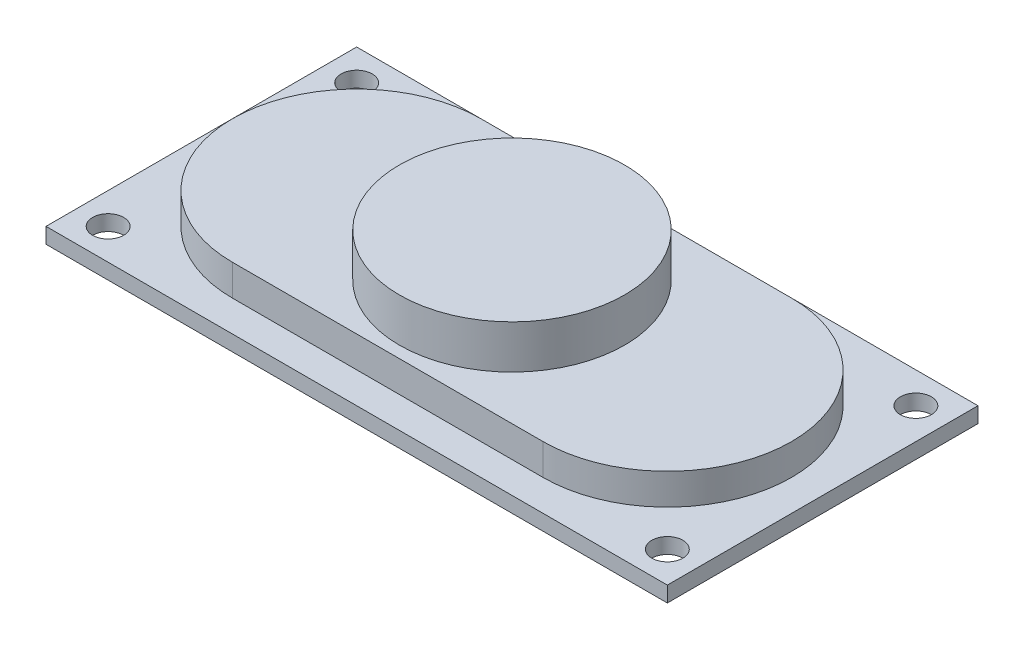
ISO-10303-21;
HEADER;
FILE_DESCRIPTION(('STEP AP214'),'2;1');
FILE_NAME('part.step','',(''),(''),'','','');
FILE_SCHEMA(('AUTOMOTIVE_DESIGN { 1 0 10303 214 1 1 1 1 }'));
ENDSEC;
DATA;
#1=APPLICATION_CONTEXT('core data for automotive mechanical design processes');
#2=APPLICATION_PROTOCOL_DEFINITION('international standard','automotive_design',2000,#1);
#3=PRODUCT_CONTEXT('',#1,'mechanical');
#4=PRODUCT('Part','Part','',(#3));
#5=PRODUCT_RELATED_PRODUCT_CATEGORY('part','',(#4));
#6=PRODUCT_DEFINITION_FORMATION('','',#4);
#7=PRODUCT_DEFINITION_CONTEXT('part definition',#1,'design');
#8=PRODUCT_DEFINITION('design','',#6,#7);
#9=PRODUCT_DEFINITION_SHAPE('','',#8);
#10=(LENGTH_UNIT() NAMED_UNIT(*) SI_UNIT(.MILLI.,.METRE.));
#11=(NAMED_UNIT(*) PLANE_ANGLE_UNIT() SI_UNIT($,.RADIAN.));
#12=(NAMED_UNIT(*) SI_UNIT($,.STERADIAN.) SOLID_ANGLE_UNIT());
#13=UNCERTAINTY_MEASURE_WITH_UNIT(LENGTH_MEASURE(1.E-05),#10,'distance_accuracy_value','');
#14=(GEOMETRIC_REPRESENTATION_CONTEXT(3) GLOBAL_UNCERTAINTY_ASSIGNED_CONTEXT((#13)) GLOBAL_UNIT_ASSIGNED_CONTEXT((#10,
#11,#12)) REPRESENTATION_CONTEXT('',''));
#15=CARTESIAN_POINT('',(0.,0.,0.));
#16=DIRECTION('',(0.,0.,1.));
#17=DIRECTION('',(1.,0.,0.));
#18=AXIS2_PLACEMENT_3D('',#15,#16,#17);
#19=CARTESIAN_POINT('',(0.,1.,0.));
#20=DIRECTION('',(0.,1.,0.));
#21=DIRECTION('',(0.,0.,1.));
#22=AXIS2_PLACEMENT_3D('',#19,#20,#21);
#23=PLANE('',#22);
#24=CARTESIAN_POINT('',(18.,1.,-8.));
#25=DIRECTION('',(0.,1.,0.));
#26=DIRECTION('',(0.,0.,-1.));
#27=AXIS2_PLACEMENT_3D('',#24,#25,#26);
#28=CIRCLE('',#27,1.);
#29=CARTESIAN_POINT('',(18.,1.,-9.));
#30=VERTEX_POINT('',#29);
#31=EDGE_CURVE('E202',#30,#30,#28,.T.);
#32=ORIENTED_EDGE('',*,*,#31,.F.);
#33=EDGE_LOOP('',(#32));
#34=FACE_BOUND('',#33,.T.);
#35=CARTESIAN_POINT('',(18.,1.,8.));
#36=DIRECTION('',(0.,1.,0.));
#37=DIRECTION('',(0.,0.,1.));
#38=AXIS2_PLACEMENT_3D('',#35,#36,#37);
#39=CIRCLE('',#38,1.);
#40=CARTESIAN_POINT('',(18.,1.,9.));
#41=VERTEX_POINT('',#40);
#42=EDGE_CURVE('E208',#41,#41,#39,.T.);
#43=ORIENTED_EDGE('',*,*,#42,.F.);
#44=EDGE_LOOP('',(#43));
#45=FACE_BOUND('',#44,.T.);
#46=CARTESIAN_POINT('',(-18.,1.,8.));
#47=DIRECTION('',(0.,1.,0.));
#48=DIRECTION('',(0.,0.,-1.));
#49=AXIS2_PLACEMENT_3D('',#46,#47,#48);
#50=CIRCLE('',#49,1.);
#51=CARTESIAN_POINT('',(-18.,1.,7.));
#52=VERTEX_POINT('',#51);
#53=EDGE_CURVE('E197',#52,#52,#50,.T.);
#54=ORIENTED_EDGE('',*,*,#53,.F.);
#55=EDGE_LOOP('',(#54));
#56=FACE_BOUND('',#55,.T.);
#57=CARTESIAN_POINT('',(-18.,1.,-8.));
#58=DIRECTION('',(0.,1.,0.));
#59=DIRECTION('',(0.,0.,1.));
#60=AXIS2_PLACEMENT_3D('',#57,#58,#59);
#61=CIRCLE('',#60,1.);
#62=CARTESIAN_POINT('',(-18.,1.,-7.));
#63=VERTEX_POINT('',#62);
#64=EDGE_CURVE('E201',#63,#63,#61,.T.);
#65=ORIENTED_EDGE('',*,*,#64,.F.);
#66=EDGE_LOOP('',(#65));
#67=FACE_BOUND('',#66,.T.);
#68=DIRECTION('',(0.,0.,1.));
#69=VECTOR('',#68,1.);
#70=CARTESIAN_POINT('',(-20.,1.,-10.));
#71=LINE('',#70,#69);
#72=CARTESIAN_POINT('',(-20.,1.,-10.));
#73=VERTEX_POINT('',#72);
#74=CARTESIAN_POINT('',(-20.,1.,10.));
#75=VERTEX_POINT('',#74);
#76=EDGE_CURVE('E222',#73,#75,#71,.T.);
#77=ORIENTED_EDGE('',*,*,#76,.T.);
#78=DIRECTION('',(1.,0.,0.));
#79=VECTOR('',#78,1.);
#80=CARTESIAN_POINT('',(-20.,1.,10.));
#81=LINE('',#80,#79);
#82=CARTESIAN_POINT('',(20.,1.,9.99999999999999));
#83=VERTEX_POINT('',#82);
#84=EDGE_CURVE('E225',#75,#83,#81,.T.);
#85=ORIENTED_EDGE('',*,*,#84,.T.);
#86=DIRECTION('',(0.,0.,-1.));
#87=VECTOR('',#86,1.);
#88=CARTESIAN_POINT('',(20.,1.,-10.));
#89=LINE('',#88,#87);
#90=CARTESIAN_POINT('',(20.,1.,-10.));
#91=VERTEX_POINT('',#90);
#92=EDGE_CURVE('E228',#83,#91,#89,.T.);
#93=ORIENTED_EDGE('',*,*,#92,.T.);
#94=DIRECTION('',(-1.,0.,0.));
#95=VECTOR('',#94,1.);
#96=CARTESIAN_POINT('',(-20.,1.,-10.));
#97=LINE('',#96,#95);
#98=EDGE_CURVE('E230',#91,#73,#97,.T.);
#99=ORIENTED_EDGE('',*,*,#98,.T.);
#100=EDGE_LOOP('',(#77,#85,#93,#99));
#101=FACE_BOUND('',#100,.T.);
#102=DIRECTION('',(1.,0.,0.));
#103=VECTOR('',#102,1.);
#104=CARTESIAN_POINT('',(-10.,1.,8.));
#105=LINE('',#104,#103);
#106=CARTESIAN_POINT('',(-10.,1.,8.));
#107=VERTEX_POINT('',#106);
#108=CARTESIAN_POINT('',(10.,1.,8.));
#109=VERTEX_POINT('',#108);
#110=EDGE_CURVE('E184',#107,#109,#105,.T.);
#111=ORIENTED_EDGE('',*,*,#110,.F.);
#112=CARTESIAN_POINT('',(-10.,1.,0.));
#113=DIRECTION('',(0.,1.,0.));
#114=DIRECTION('',(0.,0.,1.));
#115=AXIS2_PLACEMENT_3D('',#112,#113,#114);
#116=CIRCLE('',#115,8.);
#117=CARTESIAN_POINT('',(-10.,1.,-8.));
#118=VERTEX_POINT('',#117);
#119=EDGE_CURVE('E161',#118,#107,#116,.T.);
#120=ORIENTED_EDGE('',*,*,#119,.F.);
#121=DIRECTION('',(-1.,0.,0.));
#122=VECTOR('',#121,1.);
#123=CARTESIAN_POINT('',(-10.,1.,-8.));
#124=LINE('',#123,#122);
#125=CARTESIAN_POINT('',(10.,1.,-8.));
#126=VERTEX_POINT('',#125);
#127=EDGE_CURVE('E175',#126,#118,#124,.T.);
#128=ORIENTED_EDGE('',*,*,#127,.F.);
#129=CARTESIAN_POINT('',(10.,1.,0.));
#130=DIRECTION('',(0.,1.,0.));
#131=DIRECTION('',(0.,0.,1.));
#132=AXIS2_PLACEMENT_3D('',#129,#130,#131);
#133=CIRCLE('',#132,8.);
#134=EDGE_CURVE('E186',#109,#126,#133,.T.);
#135=ORIENTED_EDGE('',*,*,#134,.F.);
#136=EDGE_LOOP('',(#111,#120,#128,#135));
#137=FACE_BOUND('',#136,.T.);
#138=ADVANCED_FACE('F37',(#34,#45,#56,#67,#101,#137),#23,.T.);
#139=CARTESIAN_POINT('',(-20.,1.,-10.));
#140=DIRECTION('',(1.,0.,0.));
#141=DIRECTION('',(0.,0.,-1.));
#142=AXIS2_PLACEMENT_3D('',#139,#140,#141);
#143=PLANE('',#142);
#144=DIRECTION('',(0.,0.,1.));
#145=VECTOR('',#144,1.);
#146=CARTESIAN_POINT('',(-20.,0.,-10.));
#147=LINE('',#146,#145);
#148=CARTESIAN_POINT('',(-20.,0.,-10.));
#149=VERTEX_POINT('',#148);
#150=CARTESIAN_POINT('',(-20.,0.,10.));
#151=VERTEX_POINT('',#150);
#152=EDGE_CURVE('E219',#149,#151,#147,.T.);
#153=ORIENTED_EDGE('',*,*,#152,.T.);
#154=DIRECTION('',(0.,-1.,0.));
#155=VECTOR('',#154,1.);
#156=CARTESIAN_POINT('',(-20.,1.,10.));
#157=LINE('',#156,#155);
#158=EDGE_CURVE('E12',#75,#151,#157,.T.);
#159=ORIENTED_EDGE('',*,*,#158,.F.);
#160=ORIENTED_EDGE('',*,*,#76,.F.);
#161=DIRECTION('',(0.,-1.,0.));
#162=VECTOR('',#161,1.);
#163=CARTESIAN_POINT('',(-20.,1.,-10.));
#164=LINE('',#163,#162);
#165=EDGE_CURVE('E232',#73,#149,#164,.T.);
#166=ORIENTED_EDGE('',*,*,#165,.T.);
#167=EDGE_LOOP('',(#153,#159,#160,#166));
#168=FACE_BOUND('',#167,.T.);
#169=ADVANCED_FACE('F39',(#168),#143,.F.);
#170=CARTESIAN_POINT('',(-20.,1.,10.));
#171=DIRECTION('',(0.,0.,-1.));
#172=DIRECTION('',(-1.,0.,0.));
#173=AXIS2_PLACEMENT_3D('',#170,#171,#172);
#174=PLANE('',#173);
#175=DIRECTION('',(1.,0.,0.));
#176=VECTOR('',#175,1.);
#177=CARTESIAN_POINT('',(-20.,0.,10.));
#178=LINE('',#177,#176);
#179=CARTESIAN_POINT('',(20.,0.,9.99999999999999));
#180=VERTEX_POINT('',#179);
#181=EDGE_CURVE('E235',#151,#180,#178,.T.);
#182=ORIENTED_EDGE('',*,*,#181,.T.);
#183=DIRECTION('',(0.,-1.,0.));
#184=VECTOR('',#183,1.);
#185=CARTESIAN_POINT('',(20.,1.,9.99999999999999));
#186=LINE('',#185,#184);
#187=EDGE_CURVE('E45',#83,#180,#186,.T.);
#188=ORIENTED_EDGE('',*,*,#187,.F.);
#189=ORIENTED_EDGE('',*,*,#84,.F.);
#190=ORIENTED_EDGE('',*,*,#158,.T.);
#191=EDGE_LOOP('',(#182,#188,#189,#190));
#192=FACE_BOUND('',#191,.T.);
#193=ADVANCED_FACE('F264',(#192),#174,.F.);
#194=CARTESIAN_POINT('',(20.,1.,-10.));
#195=DIRECTION('',(-1.,0.,0.));
#196=DIRECTION('',(0.,0.,1.));
#197=AXIS2_PLACEMENT_3D('',#194,#195,#196);
#198=PLANE('',#197);
#199=DIRECTION('',(0.,0.,-1.));
#200=VECTOR('',#199,1.);
#201=CARTESIAN_POINT('',(20.,0.,-10.));
#202=LINE('',#201,#200);
#203=CARTESIAN_POINT('',(20.,0.,-10.));
#204=VERTEX_POINT('',#203);
#205=EDGE_CURVE('E237',#180,#204,#202,.T.);
#206=ORIENTED_EDGE('',*,*,#205,.T.);
#207=DIRECTION('',(0.,-1.,0.));
#208=VECTOR('',#207,1.);
#209=CARTESIAN_POINT('',(20.,1.,-10.));
#210=LINE('',#209,#208);
#211=EDGE_CURVE('E242',#91,#204,#210,.T.);
#212=ORIENTED_EDGE('',*,*,#211,.F.);
#213=ORIENTED_EDGE('',*,*,#92,.F.);
#214=ORIENTED_EDGE('',*,*,#187,.T.);
#215=EDGE_LOOP('',(#206,#212,#213,#214));
#216=FACE_BOUND('',#215,.T.);
#217=ADVANCED_FACE('F249',(#216),#198,.F.);
#218=CARTESIAN_POINT('',(-20.,1.,-10.));
#219=DIRECTION('',(0.,0.,1.));
#220=DIRECTION('',(1.,0.,0.));
#221=AXIS2_PLACEMENT_3D('',#218,#219,#220);
#222=PLANE('',#221);
#223=DIRECTION('',(-1.,0.,0.));
#224=VECTOR('',#223,1.);
#225=CARTESIAN_POINT('',(-20.,0.,-10.));
#226=LINE('',#225,#224);
#227=EDGE_CURVE('E226',#204,#149,#226,.T.);
#228=ORIENTED_EDGE('',*,*,#227,.T.);
#229=ORIENTED_EDGE('',*,*,#165,.F.);
#230=ORIENTED_EDGE('',*,*,#98,.F.);
#231=ORIENTED_EDGE('',*,*,#211,.T.);
#232=EDGE_LOOP('',(#228,#229,#230,#231));
#233=FACE_BOUND('',#232,.T.);
#234=ADVANCED_FACE('F257',(#233),#222,.F.);
#235=CARTESIAN_POINT('',(0.,0.,0.));
#236=DIRECTION('',(0.,1.,0.));
#237=DIRECTION('',(0.,0.,1.));
#238=AXIS2_PLACEMENT_3D('',#235,#236,#237);
#239=PLANE('',#238);
#240=DIRECTION('',(1.,0.,0.));
#241=VECTOR('',#240,1.);
#242=CARTESIAN_POINT('',(-10.,0.,7.));
#243=LINE('',#242,#241);
#244=CARTESIAN_POINT('',(-10.,0.,7.));
#245=VERTEX_POINT('',#244);
#246=CARTESIAN_POINT('',(10.,0.,7.));
#247=VERTEX_POINT('',#246);
#248=EDGE_CURVE('E139',#245,#247,#243,.T.);
#249=ORIENTED_EDGE('',*,*,#248,.T.);
#250=CARTESIAN_POINT('',(10.,0.,0.));
#251=DIRECTION('',(0.,1.,0.));
#252=DIRECTION('',(0.,0.,1.));
#253=AXIS2_PLACEMENT_3D('',#250,#251,#252);
#254=CIRCLE('',#253,7.);
#255=CARTESIAN_POINT('',(10.,0.,-7.));
#256=VERTEX_POINT('',#255);
#257=EDGE_CURVE('E128',#247,#256,#254,.T.);
#258=ORIENTED_EDGE('',*,*,#257,.T.);
#259=DIRECTION('',(-1.,0.,0.));
#260=VECTOR('',#259,1.);
#261=CARTESIAN_POINT('',(-10.,0.,-7.));
#262=LINE('',#261,#260);
#263=CARTESIAN_POINT('',(-10.,0.,-7.));
#264=VERTEX_POINT('',#263);
#265=EDGE_CURVE('E138',#256,#264,#262,.T.);
#266=ORIENTED_EDGE('',*,*,#265,.T.);
#267=CARTESIAN_POINT('',(-10.,0.,0.));
#268=DIRECTION('',(0.,1.,0.));
#269=DIRECTION('',(0.,0.,1.));
#270=AXIS2_PLACEMENT_3D('',#267,#268,#269);
#271=CIRCLE('',#270,7.);
#272=EDGE_CURVE('E151',#264,#245,#271,.T.);
#273=ORIENTED_EDGE('',*,*,#272,.T.);
#274=EDGE_LOOP('',(#249,#258,#266,#273));
#275=FACE_BOUND('',#274,.T.);
#276=CARTESIAN_POINT('',(18.,0.,-8.));
#277=DIRECTION('',(0.,1.,0.));
#278=DIRECTION('',(0.,0.,-1.));
#279=AXIS2_PLACEMENT_3D('',#276,#277,#278);
#280=CIRCLE('',#279,1.);
#281=CARTESIAN_POINT('',(18.,0.,-9.));
#282=VERTEX_POINT('',#281);
#283=EDGE_CURVE('E198',#282,#282,#280,.T.);
#284=ORIENTED_EDGE('',*,*,#283,.T.);
#285=EDGE_LOOP('',(#284));
#286=FACE_BOUND('',#285,.T.);
#287=CARTESIAN_POINT('',(18.,0.,8.));
#288=DIRECTION('',(0.,1.,0.));
#289=DIRECTION('',(0.,0.,1.));
#290=AXIS2_PLACEMENT_3D('',#287,#288,#289);
#291=CIRCLE('',#290,1.);
#292=CARTESIAN_POINT('',(18.,0.,9.));
#293=VERTEX_POINT('',#292);
#294=EDGE_CURVE('E205',#293,#293,#291,.T.);
#295=ORIENTED_EDGE('',*,*,#294,.T.);
#296=EDGE_LOOP('',(#295));
#297=FACE_BOUND('',#296,.T.);
#298=CARTESIAN_POINT('',(-18.,0.,8.));
#299=DIRECTION('',(0.,1.,0.));
#300=DIRECTION('',(0.,0.,-1.));
#301=AXIS2_PLACEMENT_3D('',#298,#299,#300);
#302=CIRCLE('',#301,1.);
#303=CARTESIAN_POINT('',(-18.,0.,7.));
#304=VERTEX_POINT('',#303);
#305=EDGE_CURVE('E211',#304,#304,#302,.T.);
#306=ORIENTED_EDGE('',*,*,#305,.T.);
#307=EDGE_LOOP('',(#306));
#308=FACE_BOUND('',#307,.T.);
#309=CARTESIAN_POINT('',(-18.,0.,-8.));
#310=DIRECTION('',(0.,1.,0.));
#311=DIRECTION('',(0.,0.,1.));
#312=AXIS2_PLACEMENT_3D('',#309,#310,#311);
#313=CIRCLE('',#312,1.);
#314=CARTESIAN_POINT('',(-18.,0.,-7.));
#315=VERTEX_POINT('',#314);
#316=EDGE_CURVE('E216',#315,#315,#313,.T.);
#317=ORIENTED_EDGE('',*,*,#316,.T.);
#318=EDGE_LOOP('',(#317));
#319=FACE_BOUND('',#318,.T.);
#320=ORIENTED_EDGE('',*,*,#152,.F.);
#321=ORIENTED_EDGE('',*,*,#227,.F.);
#322=ORIENTED_EDGE('',*,*,#205,.F.);
#323=ORIENTED_EDGE('',*,*,#181,.F.);
#324=EDGE_LOOP('',(#320,#321,#322,#323));
#325=FACE_BOUND('',#324,.T.);
#326=ADVANCED_FACE('F149',(#275,#286,#297,#308,#319,#325),#239,.F.);
#327=CARTESIAN_POINT('',(-18.,0.,-8.));
#328=DIRECTION('',(0.,1.,0.));
#329=DIRECTION('',(0.,0.,1.));
#330=AXIS2_PLACEMENT_3D('',#327,#328,#329);
#331=CYLINDRICAL_SURFACE('',#330,1.);
#332=ORIENTED_EDGE('',*,*,#316,.F.);
#333=EDGE_LOOP('',(#332));
#334=FACE_BOUND('',#333,.T.);
#335=ORIENTED_EDGE('',*,*,#64,.T.);
#336=EDGE_LOOP('',(#335));
#337=FACE_BOUND('',#336,.T.);
#338=ADVANCED_FACE('F282',(#334,#337),#331,.F.);
#339=CARTESIAN_POINT('',(-18.,0.,8.));
#340=DIRECTION('',(0.,1.,0.));
#341=DIRECTION('',(0.,0.,1.));
#342=AXIS2_PLACEMENT_3D('',#339,#340,#341);
#343=CYLINDRICAL_SURFACE('',#342,1.);
#344=ORIENTED_EDGE('',*,*,#305,.F.);
#345=EDGE_LOOP('',(#344));
#346=FACE_BOUND('',#345,.T.);
#347=ORIENTED_EDGE('',*,*,#53,.T.);
#348=EDGE_LOOP('',(#347));
#349=FACE_BOUND('',#348,.T.);
#350=ADVANCED_FACE('F312',(#346,#349),#343,.F.);
#351=CARTESIAN_POINT('',(18.,0.,8.));
#352=DIRECTION('',(0.,1.,0.));
#353=DIRECTION('',(0.,0.,1.));
#354=AXIS2_PLACEMENT_3D('',#351,#352,#353);
#355=CYLINDRICAL_SURFACE('',#354,1.);
#356=ORIENTED_EDGE('',*,*,#294,.F.);
#357=EDGE_LOOP('',(#356));
#358=FACE_BOUND('',#357,.T.);
#359=ORIENTED_EDGE('',*,*,#42,.T.);
#360=EDGE_LOOP('',(#359));
#361=FACE_BOUND('',#360,.T.);
#362=ADVANCED_FACE('F318',(#358,#361),#355,.F.);
#363=CARTESIAN_POINT('',(18.,0.,-8.));
#364=DIRECTION('',(0.,1.,0.));
#365=DIRECTION('',(0.,0.,1.));
#366=AXIS2_PLACEMENT_3D('',#363,#364,#365);
#367=CYLINDRICAL_SURFACE('',#366,1.);
#368=ORIENTED_EDGE('',*,*,#283,.F.);
#369=EDGE_LOOP('',(#368));
#370=FACE_BOUND('',#369,.T.);
#371=ORIENTED_EDGE('',*,*,#31,.T.);
#372=EDGE_LOOP('',(#371));
#373=FACE_BOUND('',#372,.T.);
#374=ADVANCED_FACE('F325',(#370,#373),#367,.F.);
#375=CARTESIAN_POINT('',(-10.,3.,0.));
#376=DIRECTION('',(0.,-1.,0.));
#377=DIRECTION('',(0.,0.,-1.));
#378=AXIS2_PLACEMENT_3D('',#375,#376,#377);
#379=CYLINDRICAL_SURFACE('',#378,8.);
#380=ORIENTED_EDGE('',*,*,#119,.T.);
#381=DIRECTION('',(0.,-1.,0.));
#382=VECTOR('',#381,1.);
#383=CARTESIAN_POINT('',(-10.,3.,8.));
#384=LINE('',#383,#382);
#385=CARTESIAN_POINT('',(-10.,3.,8.));
#386=VERTEX_POINT('',#385);
#387=EDGE_CURVE('E195',#386,#107,#384,.T.);
#388=ORIENTED_EDGE('',*,*,#387,.F.);
#389=CARTESIAN_POINT('',(-10.,3.,0.));
#390=DIRECTION('',(0.,1.,0.));
#391=DIRECTION('',(0.,0.,1.));
#392=AXIS2_PLACEMENT_3D('',#389,#390,#391);
#393=CIRCLE('',#392,8.);
#394=CARTESIAN_POINT('',(-10.,3.,-8.));
#395=VERTEX_POINT('',#394);
#396=EDGE_CURVE('E171',#395,#386,#393,.T.);
#397=ORIENTED_EDGE('',*,*,#396,.F.);
#398=DIRECTION('',(0.,-1.,0.));
#399=VECTOR('',#398,1.);
#400=CARTESIAN_POINT('',(-10.,3.,-8.));
#401=LINE('',#400,#399);
#402=EDGE_CURVE('E181',#395,#118,#401,.T.);
#403=ORIENTED_EDGE('',*,*,#402,.T.);
#404=EDGE_LOOP('',(#380,#388,#397,#403));
#405=FACE_BOUND('',#404,.T.);
#406=ADVANCED_FACE('F332',(#405),#379,.T.);
#407=CARTESIAN_POINT('',(-10.,3.,8.));
#408=DIRECTION('',(0.,0.,-1.));
#409=DIRECTION('',(-1.,0.,0.));
#410=AXIS2_PLACEMENT_3D('',#407,#408,#409);
#411=PLANE('',#410);
#412=ORIENTED_EDGE('',*,*,#110,.T.);
#413=DIRECTION('',(0.,-1.,0.));
#414=VECTOR('',#413,1.);
#415=CARTESIAN_POINT('',(10.,3.,8.));
#416=LINE('',#415,#414);
#417=CARTESIAN_POINT('',(10.,3.,8.));
#418=VERTEX_POINT('',#417);
#419=EDGE_CURVE('E192',#418,#109,#416,.T.);
#420=ORIENTED_EDGE('',*,*,#419,.F.);
#421=DIRECTION('',(1.,0.,0.));
#422=VECTOR('',#421,1.);
#423=CARTESIAN_POINT('',(-10.,3.,8.));
#424=LINE('',#423,#422);
#425=EDGE_CURVE('E174',#386,#418,#424,.T.);
#426=ORIENTED_EDGE('',*,*,#425,.F.);
#427=ORIENTED_EDGE('',*,*,#387,.T.);
#428=EDGE_LOOP('',(#412,#420,#426,#427));
#429=FACE_BOUND('',#428,.T.);
#430=ADVANCED_FACE('F338',(#429),#411,.F.);
#431=CARTESIAN_POINT('',(10.,3.,0.));
#432=DIRECTION('',(0.,-1.,0.));
#433=DIRECTION('',(0.,0.,-1.));
#434=AXIS2_PLACEMENT_3D('',#431,#432,#433);
#435=CYLINDRICAL_SURFACE('',#434,8.);
#436=ORIENTED_EDGE('',*,*,#134,.T.);
#437=DIRECTION('',(0.,-1.,0.));
#438=VECTOR('',#437,1.);
#439=CARTESIAN_POINT('',(10.,3.,-8.));
#440=LINE('',#439,#438);
#441=CARTESIAN_POINT('',(10.,3.,-8.));
#442=VERTEX_POINT('',#441);
#443=EDGE_CURVE('E60',#442,#126,#440,.T.);
#444=ORIENTED_EDGE('',*,*,#443,.F.);
#445=CARTESIAN_POINT('',(10.,3.,0.));
#446=DIRECTION('',(0.,1.,0.));
#447=DIRECTION('',(0.,0.,1.));
#448=AXIS2_PLACEMENT_3D('',#445,#446,#447);
#449=CIRCLE('',#448,8.);
#450=EDGE_CURVE('E177',#418,#442,#449,.T.);
#451=ORIENTED_EDGE('',*,*,#450,.F.);
#452=ORIENTED_EDGE('',*,*,#419,.T.);
#453=EDGE_LOOP('',(#436,#444,#451,#452));
#454=FACE_BOUND('',#453,.T.);
#455=ADVANCED_FACE('F345',(#454),#435,.T.);
#456=CARTESIAN_POINT('',(-10.,3.,-8.));
#457=DIRECTION('',(0.,0.,1.));
#458=DIRECTION('',(1.,0.,0.));
#459=AXIS2_PLACEMENT_3D('',#456,#457,#458);
#460=PLANE('',#459);
#461=ORIENTED_EDGE('',*,*,#127,.T.);
#462=ORIENTED_EDGE('',*,*,#402,.F.);
#463=DIRECTION('',(-1.,0.,0.));
#464=VECTOR('',#463,1.);
#465=CARTESIAN_POINT('',(-10.,3.,-8.));
#466=LINE('',#465,#464);
#467=EDGE_CURVE('E179',#442,#395,#466,.T.);
#468=ORIENTED_EDGE('',*,*,#467,.F.);
#469=ORIENTED_EDGE('',*,*,#443,.T.);
#470=EDGE_LOOP('',(#461,#462,#468,#469));
#471=FACE_BOUND('',#470,.T.);
#472=ADVANCED_FACE('F353',(#471),#460,.F.);
#473=CARTESIAN_POINT('',(-10.,3.,0.));
#474=DIRECTION('',(0.,1.,0.));
#475=DIRECTION('',(0.,0.,1.));
#476=AXIS2_PLACEMENT_3D('',#473,#474,#475);
#477=PLANE('',#476);
#478=CARTESIAN_POINT('',(0.,3.,0.));
#479=DIRECTION('',(0.,1.,0.));
#480=DIRECTION('',(0.,0.,1.));
#481=AXIS2_PLACEMENT_3D('',#478,#479,#480);
#482=CIRCLE('',#481,7.25);
#483=CARTESIAN_POINT('',(0.,3.,7.25));
#484=VERTEX_POINT('',#483);
#485=EDGE_CURVE('E447',#484,#484,#482,.T.);
#486=ORIENTED_EDGE('',*,*,#485,.F.);
#487=EDGE_LOOP('',(#486));
#488=FACE_BOUND('',#487,.T.);
#489=ORIENTED_EDGE('',*,*,#396,.T.);
#490=ORIENTED_EDGE('',*,*,#425,.T.);
#491=ORIENTED_EDGE('',*,*,#450,.T.);
#492=ORIENTED_EDGE('',*,*,#467,.T.);
#493=EDGE_LOOP('',(#489,#490,#491,#492));
#494=FACE_BOUND('',#493,.T.);
#495=ADVANCED_FACE('F360',(#488,#494),#477,.T.);
#496=CARTESIAN_POINT('',(-10.,3.,0.));
#497=DIRECTION('',(0.,-1.,0.));
#498=DIRECTION('',(0.,0.,-1.));
#499=AXIS2_PLACEMENT_3D('',#496,#497,#498);
#500=CYLINDRICAL_SURFACE('',#499,7.);
#501=ORIENTED_EDGE('',*,*,#272,.F.);
#502=DIRECTION('',(0.,-1.,0.));
#503=VECTOR('',#502,1.);
#504=CARTESIAN_POINT('',(-10.,3.,-7.));
#505=LINE('',#504,#503);
#506=CARTESIAN_POINT('',(-10.,2.,-7.));
#507=VERTEX_POINT('',#506);
#508=EDGE_CURVE('E52',#507,#264,#505,.T.);
#509=ORIENTED_EDGE('',*,*,#508,.F.);
#510=CARTESIAN_POINT('',(-10.,2.,0.));
#511=DIRECTION('',(0.,1.,0.));
#512=DIRECTION('',(0.,0.,1.));
#513=AXIS2_PLACEMENT_3D('',#510,#511,#512);
#514=CIRCLE('',#513,7.);
#515=CARTESIAN_POINT('',(-10.,2.,7.));
#516=VERTEX_POINT('',#515);
#517=EDGE_CURVE('E158',#507,#516,#514,.T.);
#518=ORIENTED_EDGE('',*,*,#517,.T.);
#519=DIRECTION('',(0.,1.,0.));
#520=VECTOR('',#519,1.);
#521=CARTESIAN_POINT('',(-10.,3.,7.));
#522=LINE('',#521,#520);
#523=EDGE_CURVE('E146',#516,#245,#522,.F.);
#524=ORIENTED_EDGE('',*,*,#523,.T.);
#525=EDGE_LOOP('',(#501,#509,#518,#524));
#526=FACE_BOUND('',#525,.T.);
#527=ADVANCED_FACE('F367',(#526),#500,.F.);
#528=CARTESIAN_POINT('',(-10.,3.,7.));
#529=DIRECTION('',(0.,0.,-1.));
#530=DIRECTION('',(-1.,0.,0.));
#531=AXIS2_PLACEMENT_3D('',#528,#529,#530);
#532=PLANE('',#531);
#533=ORIENTED_EDGE('',*,*,#248,.F.);
#534=ORIENTED_EDGE('',*,*,#523,.F.);
#535=DIRECTION('',(1.,0.,0.));
#536=VECTOR('',#535,1.);
#537=CARTESIAN_POINT('',(-10.,2.,7.));
#538=LINE('',#537,#536);
#539=CARTESIAN_POINT('',(10.,2.,7.));
#540=VERTEX_POINT('',#539);
#541=EDGE_CURVE('E145',#516,#540,#538,.T.);
#542=ORIENTED_EDGE('',*,*,#541,.T.);
#543=DIRECTION('',(0.,-1.,0.));
#544=VECTOR('',#543,1.);
#545=CARTESIAN_POINT('',(10.,3.,7.));
#546=LINE('',#545,#544);
#547=EDGE_CURVE('E131',#540,#247,#546,.T.);
#548=ORIENTED_EDGE('',*,*,#547,.T.);
#549=EDGE_LOOP('',(#533,#534,#542,#548));
#550=FACE_BOUND('',#549,.T.);
#551=ADVANCED_FACE('F142',(#550),#532,.T.);
#552=CARTESIAN_POINT('',(10.,3.,0.));
#553=DIRECTION('',(0.,-1.,0.));
#554=DIRECTION('',(0.,0.,-1.));
#555=AXIS2_PLACEMENT_3D('',#552,#553,#554);
#556=CYLINDRICAL_SURFACE('',#555,7.);
#557=ORIENTED_EDGE('',*,*,#257,.F.);
#558=ORIENTED_EDGE('',*,*,#547,.F.);
#559=CARTESIAN_POINT('',(10.,2.,0.));
#560=DIRECTION('',(0.,1.,0.));
#561=DIRECTION('',(0.,0.,1.));
#562=AXIS2_PLACEMENT_3D('',#559,#560,#561);
#563=CIRCLE('',#562,7.);
#564=CARTESIAN_POINT('',(10.,2.,-7.));
#565=VERTEX_POINT('',#564);
#566=EDGE_CURVE('E167',#540,#565,#563,.T.);
#567=ORIENTED_EDGE('',*,*,#566,.T.);
#568=DIRECTION('',(0.,1.,0.));
#569=VECTOR('',#568,1.);
#570=CARTESIAN_POINT('',(10.,3.,-7.));
#571=LINE('',#570,#569);
#572=EDGE_CURVE('E134',#565,#256,#571,.F.);
#573=ORIENTED_EDGE('',*,*,#572,.T.);
#574=EDGE_LOOP('',(#557,#558,#567,#573));
#575=FACE_BOUND('',#574,.T.);
#576=ADVANCED_FACE('F130',(#575),#556,.F.);
#577=CARTESIAN_POINT('',(-10.,3.,-7.));
#578=DIRECTION('',(0.,0.,1.));
#579=DIRECTION('',(1.,0.,0.));
#580=AXIS2_PLACEMENT_3D('',#577,#578,#579);
#581=PLANE('',#580);
#582=ORIENTED_EDGE('',*,*,#265,.F.);
#583=ORIENTED_EDGE('',*,*,#572,.F.);
#584=DIRECTION('',(-1.,0.,0.));
#585=VECTOR('',#584,1.);
#586=CARTESIAN_POINT('',(-10.,2.,-7.));
#587=LINE('',#586,#585);
#588=EDGE_CURVE('E164',#565,#507,#587,.T.);
#589=ORIENTED_EDGE('',*,*,#588,.T.);
#590=ORIENTED_EDGE('',*,*,#508,.T.);
#591=EDGE_LOOP('',(#582,#583,#589,#590));
#592=FACE_BOUND('',#591,.T.);
#593=ADVANCED_FACE('F389',(#592),#581,.T.);
#594=CARTESIAN_POINT('',(-10.,2.,0.));
#595=DIRECTION('',(0.,1.,0.));
#596=DIRECTION('',(0.,0.,1.));
#597=AXIS2_PLACEMENT_3D('',#594,#595,#596);
#598=PLANE('',#597);
#599=ORIENTED_EDGE('',*,*,#517,.F.);
#600=ORIENTED_EDGE('',*,*,#588,.F.);
#601=ORIENTED_EDGE('',*,*,#566,.F.);
#602=ORIENTED_EDGE('',*,*,#541,.F.);
#603=EDGE_LOOP('',(#599,#600,#601,#602));
#604=FACE_BOUND('',#603,.T.);
#605=ADVANCED_FACE('F396',(#604),#598,.F.);
#606=CARTESIAN_POINT('',(0.,32.1060966544099,0.));
#607=DIRECTION('',(0.,-1.,0.));
#608=DIRECTION('',(0.,0.,-1.));
#609=AXIS2_PLACEMENT_3D('',#606,#607,#608);
#610=CYLINDRICAL_SURFACE('',#609,7.25);
#611=ORIENTED_EDGE('',*,*,#485,.T.);
#612=EDGE_LOOP('',(#611));
#613=FACE_BOUND('',#612,.T.);
#614=CARTESIAN_POINT('',(0.,5.8,0.));
#615=DIRECTION('',(0.,1.,0.));
#616=DIRECTION('',(0.,0.,1.));
#617=AXIS2_PLACEMENT_3D('',#614,#615,#616);
#618=CIRCLE('',#617,7.25);
#619=CARTESIAN_POINT('',(0.,5.8,7.25));
#620=VERTEX_POINT('',#619);
#621=EDGE_CURVE('E153',#620,#620,#618,.T.);
#622=ORIENTED_EDGE('',*,*,#621,.F.);
#623=EDGE_LOOP('',(#622));
#624=FACE_BOUND('',#623,.T.);
#625=ADVANCED_FACE('F402',(#613,#624),#610,.T.);
#626=CARTESIAN_POINT('',(0.,5.8,0.));
#627=DIRECTION('',(0.,1.,0.));
#628=DIRECTION('',(0.,0.,1.));
#629=AXIS2_PLACEMENT_3D('',#626,#627,#628);
#630=PLANE('',#629);
#631=ORIENTED_EDGE('',*,*,#621,.T.);
#632=EDGE_LOOP('',(#631));
#633=FACE_BOUND('',#632,.T.);
#634=ADVANCED_FACE('F409',(#633),#630,.T.);
#635=CLOSED_SHELL('',(#138,#169,#193,#217,#234,#326,#338,#350,#362,#374,#406,#430,#455,#472,
#495,#527,#551,#576,#593,#605,#625,#634));
#636=MANIFOLD_SOLID_BREP('B2',#635);
#637=ADVANCED_BREP_SHAPE_REPRESENTATION('',(#18,#636),#14);
#638=SHAPE_DEFINITION_REPRESENTATION(#9,#637);
ENDSEC;
END-ISO-10303-21;
